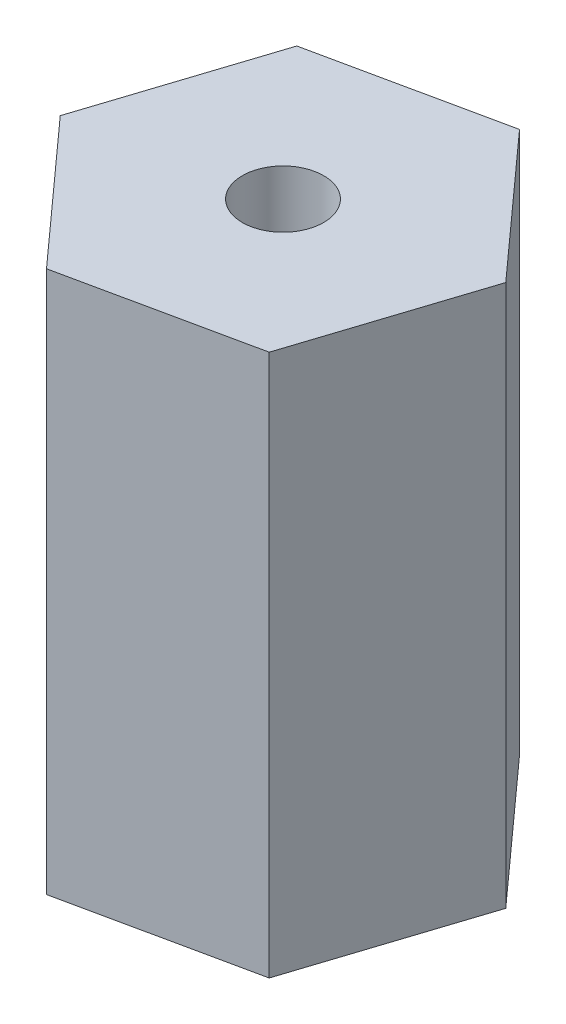
ISO-10303-21;
HEADER;
FILE_DESCRIPTION(('STEP AP214'),'2;1');
FILE_NAME('part.step','',(''),(''),'','','');
FILE_SCHEMA(('AUTOMOTIVE_DESIGN { 1 0 10303 214 1 1 1 1 }'));
ENDSEC;
DATA;
#1=APPLICATION_CONTEXT('core data for automotive mechanical design processes');
#2=APPLICATION_PROTOCOL_DEFINITION('international standard','automotive_design',2000,#1);
#3=PRODUCT_CONTEXT('',#1,'mechanical');
#4=PRODUCT('Part','Part','',(#3));
#5=PRODUCT_RELATED_PRODUCT_CATEGORY('part','',(#4));
#6=PRODUCT_DEFINITION_FORMATION('','',#4);
#7=PRODUCT_DEFINITION_CONTEXT('part definition',#1,'design');
#8=PRODUCT_DEFINITION('design','',#6,#7);
#9=PRODUCT_DEFINITION_SHAPE('','',#8);
#10=(LENGTH_UNIT() NAMED_UNIT(*) SI_UNIT(.MILLI.,.METRE.));
#11=(NAMED_UNIT(*) PLANE_ANGLE_UNIT() SI_UNIT($,.RADIAN.));
#12=(NAMED_UNIT(*) SI_UNIT($,.STERADIAN.) SOLID_ANGLE_UNIT());
#13=UNCERTAINTY_MEASURE_WITH_UNIT(LENGTH_MEASURE(1.E-05),#10,'distance_accuracy_value','');
#14=(GEOMETRIC_REPRESENTATION_CONTEXT(3) GLOBAL_UNCERTAINTY_ASSIGNED_CONTEXT((#13)) GLOBAL_UNIT_ASSIGNED_CONTEXT((#10,
#11,#12)) REPRESENTATION_CONTEXT('',''));
#15=CARTESIAN_POINT('',(0.,0.,0.));
#16=DIRECTION('',(0.,0.,1.));
#17=DIRECTION('',(1.,0.,0.));
#18=AXIS2_PLACEMENT_3D('',#15,#16,#17);
#19=CARTESIAN_POINT('',(0.,20.,0.));
#20=DIRECTION('',(0.,1.,0.));
#21=DIRECTION('',(0.,0.,1.));
#22=AXIS2_PLACEMENT_3D('',#19,#20,#21);
#23=PLANE('',#22);
#24=DIRECTION('',(0.978040004003725,0.,-0.20841725112954));
#25=VECTOR('',#24,1.);
#26=CARTESIAN_POINT('',(-2.1375264507614,20.,6.59021856028276));
#27=LINE('',#26,#25);
#28=CARTESIAN_POINT('',(-2.1375264507614,20.,6.59021856028276));
#29=VERTEX_POINT('',#28);
#30=CARTESIAN_POINT('',(4.63853346431588,20.,5.14626148776194));
#31=VERTEX_POINT('',#30);
#32=EDGE_CURVE('E135',#29,#31,#27,.T.);
#33=ORIENTED_EDGE('',*,*,#32,.T.);
#34=DIRECTION('',(0.30852536793676,0.,-0.95121611494943));
#35=VECTOR('',#34,1.);
#36=CARTESIAN_POINT('',(4.63853346431588,20.,5.14626148776194));
#37=LINE('',#36,#35);
#38=CARTESIAN_POINT('',(6.77605991507728,20.,-1.44395707252082));
#39=VERTEX_POINT('',#38);
#40=EDGE_CURVE('E93',#31,#39,#37,.T.);
#41=ORIENTED_EDGE('',*,*,#40,.T.);
#42=DIRECTION('',(-0.669514636066964,0.,-0.74279886381989));
#43=VECTOR('',#42,1.);
#44=CARTESIAN_POINT('',(6.77605991507728,20.,-1.44395707252082));
#45=LINE('',#44,#43);
#46=CARTESIAN_POINT('',(2.13752645076141,20.,-6.59021856028276));
#47=VERTEX_POINT('',#46);
#48=EDGE_CURVE('E106',#39,#47,#45,.T.);
#49=ORIENTED_EDGE('',*,*,#48,.T.);
#50=DIRECTION('',(-0.978040004003725,0.,0.208417251129539));
#51=VECTOR('',#50,1.);
#52=CARTESIAN_POINT('',(2.13752645076141,20.,-6.59021856028276));
#53=LINE('',#52,#51);
#54=CARTESIAN_POINT('',(-4.63853346431587,20.,-5.14626148776194));
#55=VERTEX_POINT('',#54);
#56=EDGE_CURVE('E100',#47,#55,#53,.T.);
#57=ORIENTED_EDGE('',*,*,#56,.T.);
#58=DIRECTION('',(-0.308525367936761,0.,0.95121611494943));
#59=VECTOR('',#58,1.);
#60=CARTESIAN_POINT('',(-4.63853346431587,20.,-5.14626148776194));
#61=LINE('',#60,#59);
#62=CARTESIAN_POINT('',(-6.77605991507728,20.,1.44395707252081));
#63=VERTEX_POINT('',#62);
#64=EDGE_CURVE('E104',#55,#63,#61,.T.);
#65=ORIENTED_EDGE('',*,*,#64,.T.);
#66=DIRECTION('',(0.669514636066964,0.,0.742798863819891));
#67=VECTOR('',#66,1.);
#68=CARTESIAN_POINT('',(-6.77605991507728,20.,1.44395707252081));
#69=LINE('',#68,#67);
#70=EDGE_CURVE('E56',#63,#29,#69,.T.);
#71=ORIENTED_EDGE('',*,*,#70,.T.);
#72=EDGE_LOOP('',(#33,#41,#49,#57,#65,#71));
#73=FACE_BOUND('',#72,.T.);
#74=CARTESIAN_POINT('',(0.,20.,0.));
#75=DIRECTION('',(0.,1.,0.));
#76=DIRECTION('',(0.,0.,1.));
#77=AXIS2_PLACEMENT_3D('',#74,#75,#76);
#78=CIRCLE('',#77,1.5);
#79=CARTESIAN_POINT('',(0.,20.,1.5));
#80=VERTEX_POINT('',#79);
#81=EDGE_CURVE('E128',#80,#80,#78,.T.);
#82=ORIENTED_EDGE('',*,*,#81,.F.);
#83=EDGE_LOOP('',(#82));
#84=FACE_BOUND('',#83,.T.);
#85=ADVANCED_FACE('F39',(#73,#84),#23,.T.);
#86=CARTESIAN_POINT('',(0.,0.,0.));
#87=DIRECTION('',(0.,1.,0.));
#88=DIRECTION('',(0.,0.,1.));
#89=AXIS2_PLACEMENT_3D('',#86,#87,#88);
#90=PLANE('',#89);
#91=DIRECTION('',(0.978040004003725,0.,-0.20841725112954));
#92=VECTOR('',#91,1.);
#93=CARTESIAN_POINT('',(-2.1375264507614,0.,6.59021856028276));
#94=LINE('',#93,#92);
#95=CARTESIAN_POINT('',(-2.1375264507614,0.,6.59021856028276));
#96=VERTEX_POINT('',#95);
#97=CARTESIAN_POINT('',(4.63853346431588,0.,5.14626148776194));
#98=VERTEX_POINT('',#97);
#99=EDGE_CURVE('E124',#96,#98,#94,.T.);
#100=ORIENTED_EDGE('',*,*,#99,.F.);
#101=DIRECTION('',(0.669514636066964,0.,0.742798863819891));
#102=VECTOR('',#101,1.);
#103=CARTESIAN_POINT('',(-6.77605991507728,0.,1.44395707252081));
#104=LINE('',#103,#102);
#105=CARTESIAN_POINT('',(-6.77605991507728,0.,1.44395707252081));
#106=VERTEX_POINT('',#105);
#107=EDGE_CURVE('E85',#106,#96,#104,.T.);
#108=ORIENTED_EDGE('',*,*,#107,.F.);
#109=DIRECTION('',(-0.308525367936761,0.,0.95121611494943));
#110=VECTOR('',#109,1.);
#111=CARTESIAN_POINT('',(-4.63853346431587,0.,-5.14626148776194));
#112=LINE('',#111,#110);
#113=CARTESIAN_POINT('',(-4.63853346431587,0.,-5.14626148776194));
#114=VERTEX_POINT('',#113);
#115=EDGE_CURVE('E79',#114,#106,#112,.T.);
#116=ORIENTED_EDGE('',*,*,#115,.F.);
#117=DIRECTION('',(-0.978040004003725,0.,0.208417251129539));
#118=VECTOR('',#117,1.);
#119=CARTESIAN_POINT('',(2.13752645076141,0.,-6.59021856028276));
#120=LINE('',#119,#118);
#121=CARTESIAN_POINT('',(2.13752645076141,0.,-6.59021856028276));
#122=VERTEX_POINT('',#121);
#123=EDGE_CURVE('E114',#122,#114,#120,.T.);
#124=ORIENTED_EDGE('',*,*,#123,.F.);
#125=DIRECTION('',(-0.669514636066964,0.,-0.74279886381989));
#126=VECTOR('',#125,1.);
#127=CARTESIAN_POINT('',(6.77605991507728,0.,-1.44395707252082));
#128=LINE('',#127,#126);
#129=CARTESIAN_POINT('',(6.77605991507728,0.,-1.44395707252082));
#130=VERTEX_POINT('',#129);
#131=EDGE_CURVE('E130',#130,#122,#128,.T.);
#132=ORIENTED_EDGE('',*,*,#131,.F.);
#133=DIRECTION('',(0.30852536793676,0.,-0.95121611494943));
#134=VECTOR('',#133,1.);
#135=CARTESIAN_POINT('',(4.63853346431588,0.,5.14626148776194));
#136=LINE('',#135,#134);
#137=EDGE_CURVE('E127',#98,#130,#136,.T.);
#138=ORIENTED_EDGE('',*,*,#137,.F.);
#139=EDGE_LOOP('',(#100,#108,#116,#124,#132,#138));
#140=FACE_BOUND('',#139,.T.);
#141=CARTESIAN_POINT('',(0.,0.,0.));
#142=DIRECTION('',(0.,1.,0.));
#143=DIRECTION('',(0.,0.,1.));
#144=AXIS2_PLACEMENT_3D('',#141,#142,#143);
#145=CIRCLE('',#144,1.5);
#146=CARTESIAN_POINT('',(0.,0.,1.5));
#147=VERTEX_POINT('',#146);
#148=EDGE_CURVE('E228',#147,#147,#145,.T.);
#149=ORIENTED_EDGE('',*,*,#148,.T.);
#150=EDGE_LOOP('',(#149));
#151=FACE_BOUND('',#150,.T.);
#152=ADVANCED_FACE('F144',(#140,#151),#90,.F.);
#153=CARTESIAN_POINT('',(-2.1375264507614,20.,6.59021856028276));
#154=DIRECTION('',(-0.20841725112954,0.,-0.978040004003725));
#155=DIRECTION('',(-0.978040004003725,0.,0.20841725112954));
#156=AXIS2_PLACEMENT_3D('',#153,#154,#155);
#157=PLANE('',#156);
#158=ORIENTED_EDGE('',*,*,#99,.T.);
#159=DIRECTION('',(0.,-1.,0.));
#160=VECTOR('',#159,1.);
#161=CARTESIAN_POINT('',(4.63853346431588,20.,5.14626148776194));
#162=LINE('',#161,#160);
#163=EDGE_CURVE('E11',#31,#98,#162,.T.);
#164=ORIENTED_EDGE('',*,*,#163,.F.);
#165=ORIENTED_EDGE('',*,*,#32,.F.);
#166=DIRECTION('',(0.,-1.,0.));
#167=VECTOR('',#166,1.);
#168=CARTESIAN_POINT('',(-2.1375264507614,20.,6.59021856028276));
#169=LINE('',#168,#167);
#170=EDGE_CURVE('E120',#29,#96,#169,.T.);
#171=ORIENTED_EDGE('',*,*,#170,.T.);
#172=EDGE_LOOP('',(#158,#164,#165,#171));
#173=FACE_BOUND('',#172,.T.);
#174=ADVANCED_FACE('F41',(#173),#157,.F.);
#175=CARTESIAN_POINT('',(4.63853346431588,20.,5.14626148776194));
#176=DIRECTION('',(-0.95121611494943,0.,-0.30852536793676));
#177=DIRECTION('',(-0.30852536793676,0.,0.95121611494943));
#178=AXIS2_PLACEMENT_3D('',#175,#176,#177);
#179=PLANE('',#178);
#180=ORIENTED_EDGE('',*,*,#137,.T.);
#181=DIRECTION('',(0.,-1.,0.));
#182=VECTOR('',#181,1.);
#183=CARTESIAN_POINT('',(6.77605991507728,20.,-1.44395707252082));
#184=LINE('',#183,#182);
#185=EDGE_CURVE('E48',#39,#130,#184,.T.);
#186=ORIENTED_EDGE('',*,*,#185,.F.);
#187=ORIENTED_EDGE('',*,*,#40,.F.);
#188=ORIENTED_EDGE('',*,*,#163,.T.);
#189=EDGE_LOOP('',(#180,#186,#187,#188));
#190=FACE_BOUND('',#189,.T.);
#191=ADVANCED_FACE('F169',(#190),#179,.F.);
#192=CARTESIAN_POINT('',(6.77605991507728,20.,-1.44395707252082));
#193=DIRECTION('',(-0.74279886381989,0.,0.669514636066964));
#194=DIRECTION('',(0.669514636066965,0.,0.74279886381989));
#195=AXIS2_PLACEMENT_3D('',#192,#193,#194);
#196=PLANE('',#195);
#197=ORIENTED_EDGE('',*,*,#131,.T.);
#198=DIRECTION('',(0.,-1.,0.));
#199=VECTOR('',#198,1.);
#200=CARTESIAN_POINT('',(2.13752645076141,20.,-6.59021856028276));
#201=LINE('',#200,#199);
#202=EDGE_CURVE('E115',#47,#122,#201,.T.);
#203=ORIENTED_EDGE('',*,*,#202,.F.);
#204=ORIENTED_EDGE('',*,*,#48,.F.);
#205=ORIENTED_EDGE('',*,*,#185,.T.);
#206=EDGE_LOOP('',(#197,#203,#204,#205));
#207=FACE_BOUND('',#206,.T.);
#208=ADVANCED_FACE('F141',(#207),#196,.F.);
#209=CARTESIAN_POINT('',(2.13752645076141,20.,-6.59021856028276));
#210=DIRECTION('',(0.208417251129539,0.,0.978040004003725));
#211=DIRECTION('',(0.978040004003725,0.,-0.208417251129539));
#212=AXIS2_PLACEMENT_3D('',#209,#210,#211);
#213=PLANE('',#212);
#214=ORIENTED_EDGE('',*,*,#123,.T.);
#215=DIRECTION('',(0.,-1.,0.));
#216=VECTOR('',#215,1.);
#217=CARTESIAN_POINT('',(-4.63853346431587,20.,-5.14626148776194));
#218=LINE('',#217,#216);
#219=EDGE_CURVE('E111',#55,#114,#218,.T.);
#220=ORIENTED_EDGE('',*,*,#219,.F.);
#221=ORIENTED_EDGE('',*,*,#56,.F.);
#222=ORIENTED_EDGE('',*,*,#202,.T.);
#223=EDGE_LOOP('',(#214,#220,#221,#222));
#224=FACE_BOUND('',#223,.T.);
#225=ADVANCED_FACE('F112',(#224),#213,.F.);
#226=CARTESIAN_POINT('',(-4.63853346431587,20.,-5.14626148776194));
#227=DIRECTION('',(0.951216114949429,0.,0.308525367936761));
#228=DIRECTION('',(0.308525367936761,0.,-0.95121611494943));
#229=AXIS2_PLACEMENT_3D('',#226,#227,#228);
#230=PLANE('',#229);
#231=ORIENTED_EDGE('',*,*,#115,.T.);
#232=DIRECTION('',(0.,-1.,0.));
#233=VECTOR('',#232,1.);
#234=CARTESIAN_POINT('',(-6.77605991507728,20.,1.44395707252081));
#235=LINE('',#234,#233);
#236=EDGE_CURVE('E116',#63,#106,#235,.T.);
#237=ORIENTED_EDGE('',*,*,#236,.F.);
#238=ORIENTED_EDGE('',*,*,#64,.F.);
#239=ORIENTED_EDGE('',*,*,#219,.T.);
#240=EDGE_LOOP('',(#231,#237,#238,#239));
#241=FACE_BOUND('',#240,.T.);
#242=ADVANCED_FACE('F118',(#241),#230,.F.);
#243=CARTESIAN_POINT('',(-6.77605991507728,20.,1.44395707252081));
#244=DIRECTION('',(0.742798863819891,0.,-0.669514636066964));
#245=DIRECTION('',(-0.669514636066964,0.,-0.742798863819891));
#246=AXIS2_PLACEMENT_3D('',#243,#244,#245);
#247=PLANE('',#246);
#248=ORIENTED_EDGE('',*,*,#107,.T.);
#249=ORIENTED_EDGE('',*,*,#170,.F.);
#250=ORIENTED_EDGE('',*,*,#70,.F.);
#251=ORIENTED_EDGE('',*,*,#236,.T.);
#252=EDGE_LOOP('',(#248,#249,#250,#251));
#253=FACE_BOUND('',#252,.T.);
#254=ADVANCED_FACE('F149',(#253),#247,.F.);
#255=CARTESIAN_POINT('',(0.,20.,0.));
#256=DIRECTION('',(0.,-1.,0.));
#257=DIRECTION('',(0.,0.,-1.));
#258=AXIS2_PLACEMENT_3D('',#255,#256,#257);
#259=CYLINDRICAL_SURFACE('',#258,1.5);
#260=ORIENTED_EDGE('',*,*,#81,.T.);
#261=EDGE_LOOP('',(#260));
#262=FACE_BOUND('',#261,.T.);
#263=ORIENTED_EDGE('',*,*,#148,.F.);
#264=EDGE_LOOP('',(#263));
#265=FACE_BOUND('',#264,.T.);
#266=ADVANCED_FACE('F151',(#262,#265),#259,.F.);
#267=CLOSED_SHELL('',(#85,#152,#174,#191,#208,#225,#242,#254,#266));
#268=MANIFOLD_SOLID_BREP('B2',#267);
#269=ADVANCED_BREP_SHAPE_REPRESENTATION('',(#18,#268),#14);
#270=SHAPE_DEFINITION_REPRESENTATION(#9,#269);
ENDSEC;
END-ISO-10303-21;
